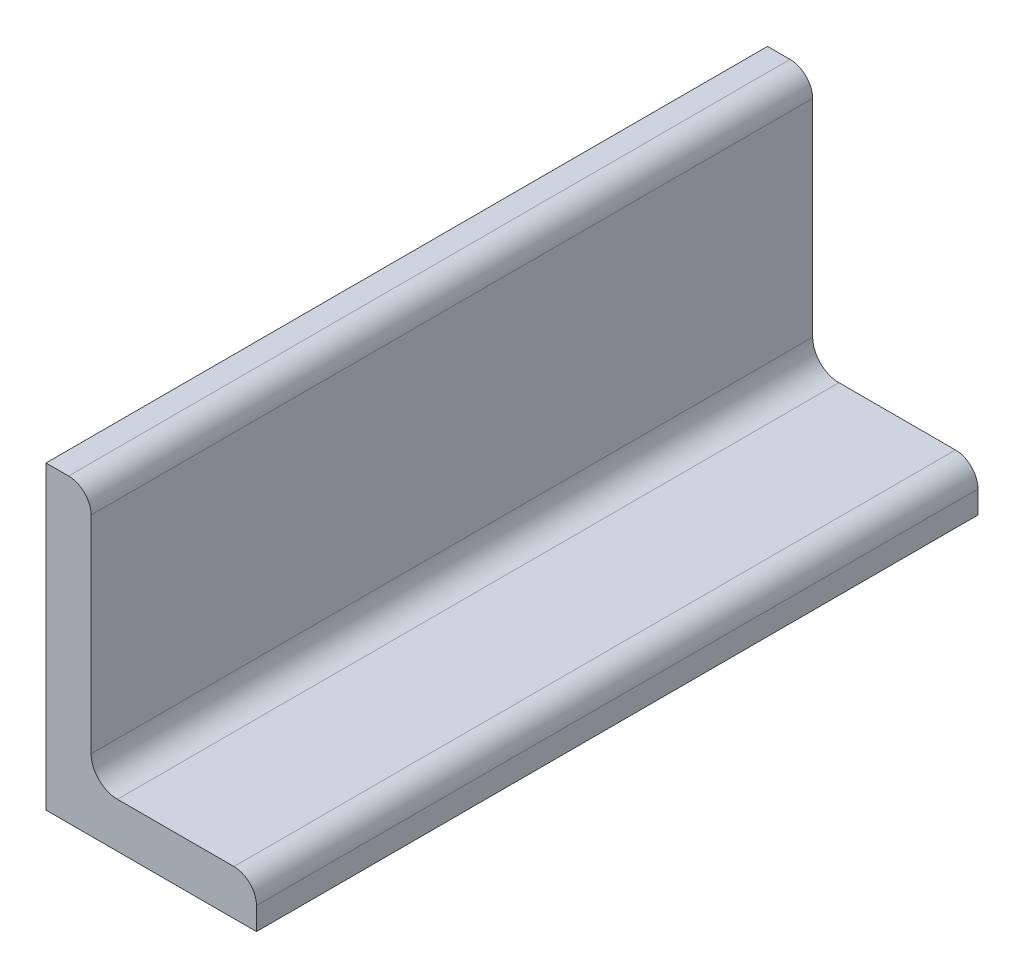
ISO-10303-21;
HEADER;
FILE_DESCRIPTION(('STEP AP214'),'2;1');
FILE_NAME('part.step','',(''),(''),'','','');
FILE_SCHEMA(('AUTOMOTIVE_DESIGN { 1 0 10303 214 1 1 1 1 }'));
ENDSEC;
DATA;
#1=APPLICATION_CONTEXT('core data for automotive mechanical design processes');
#2=APPLICATION_PROTOCOL_DEFINITION('international standard','automotive_design',2000,#1);
#3=PRODUCT_CONTEXT('',#1,'mechanical');
#4=PRODUCT('Part','Part','',(#3));
#5=PRODUCT_RELATED_PRODUCT_CATEGORY('part','',(#4));
#6=PRODUCT_DEFINITION_FORMATION('','',#4);
#7=PRODUCT_DEFINITION_CONTEXT('part definition',#1,'design');
#8=PRODUCT_DEFINITION('design','',#6,#7);
#9=PRODUCT_DEFINITION_SHAPE('','',#8);
#10=(LENGTH_UNIT() NAMED_UNIT(*) SI_UNIT(.MILLI.,.METRE.));
#11=(NAMED_UNIT(*) PLANE_ANGLE_UNIT() SI_UNIT($,.RADIAN.));
#12=(NAMED_UNIT(*) SI_UNIT($,.STERADIAN.) SOLID_ANGLE_UNIT());
#13=UNCERTAINTY_MEASURE_WITH_UNIT(LENGTH_MEASURE(1.E-05),#10,'distance_accuracy_value','');
#14=(GEOMETRIC_REPRESENTATION_CONTEXT(3) GLOBAL_UNCERTAINTY_ASSIGNED_CONTEXT((#13)) GLOBAL_UNIT_ASSIGNED_CONTEXT((#10,
#11,#12)) REPRESENTATION_CONTEXT('',''));
#15=CARTESIAN_POINT('',(0.,0.,0.));
#16=DIRECTION('',(0.,0.,1.));
#17=DIRECTION('',(1.,0.,0.));
#18=AXIS2_PLACEMENT_3D('',#15,#16,#17);
#19=CARTESIAN_POINT('',(0.0836264027816469,127.041655270204,304.8));
#20=DIRECTION('',(1.,0.,0.));
#21=DIRECTION('',(0.,0.,-1.));
#22=AXIS2_PLACEMENT_3D('',#19,#20,#21);
#23=PLANE('',#22);
#24=DIRECTION('',(0.,-1.,0.));
#25=VECTOR('',#24,1.);
#26=CARTESIAN_POINT('',(0.0836264027816469,127.041655270204,0.));
#27=LINE('',#26,#25);
#28=CARTESIAN_POINT('',(0.0836264027816469,127.041655270204,0.));
#29=VERTEX_POINT('',#28);
#30=CARTESIAN_POINT('',(0.0836264027816469,0.0416552702040917,0.));
#31=VERTEX_POINT('',#30);
#32=EDGE_CURVE('E135',#29,#31,#27,.T.);
#33=ORIENTED_EDGE('',*,*,#32,.T.);
#34=DIRECTION('',(0.,0.,-1.));
#35=VECTOR('',#34,1.);
#36=CARTESIAN_POINT('',(0.0836264027816469,0.0416552702040917,304.8));
#37=LINE('',#36,#35);
#38=CARTESIAN_POINT('',(0.0836264027816469,0.0416552702040917,304.8));
#39=VERTEX_POINT('',#38);
#40=EDGE_CURVE('E11',#39,#31,#37,.T.);
#41=ORIENTED_EDGE('',*,*,#40,.F.);
#42=DIRECTION('',(0.,-1.,0.));
#43=VECTOR('',#42,1.);
#44=CARTESIAN_POINT('',(0.0836264027816469,127.041655270204,304.8));
#45=LINE('',#44,#43);
#46=CARTESIAN_POINT('',(0.0836264027816469,127.041655270204,304.8));
#47=VERTEX_POINT('',#46);
#48=EDGE_CURVE('E151',#47,#39,#45,.T.);
#49=ORIENTED_EDGE('',*,*,#48,.F.);
#50=DIRECTION('',(0.,0.,-1.));
#51=VECTOR('',#50,1.);
#52=CARTESIAN_POINT('',(0.0836264027816469,127.041655270204,304.8));
#53=LINE('',#52,#51);
#54=EDGE_CURVE('E131',#47,#29,#53,.T.);
#55=ORIENTED_EDGE('',*,*,#54,.T.);
#56=EDGE_LOOP('',(#33,#41,#49,#55));
#57=FACE_BOUND('',#56,.T.);
#58=ADVANCED_FACE('F33',(#57),#23,.F.);
#59=CARTESIAN_POINT('',(0.0836264027816469,0.0416552702040917,304.8));
#60=DIRECTION('',(0.,1.,0.));
#61=DIRECTION('',(0.,0.,1.));
#62=AXIS2_PLACEMENT_3D('',#59,#60,#61);
#63=PLANE('',#62);
#64=DIRECTION('',(1.,0.,0.));
#65=VECTOR('',#64,1.);
#66=CARTESIAN_POINT('',(0.0836264027816469,0.0416552702040917,0.));
#67=LINE('',#66,#65);
#68=CARTESIAN_POINT('',(88.9836264027817,0.0416552702040917,0.));
#69=VERTEX_POINT('',#68);
#70=EDGE_CURVE('E138',#31,#69,#67,.T.);
#71=ORIENTED_EDGE('',*,*,#70,.T.);
#72=DIRECTION('',(0.,0.,-1.));
#73=VECTOR('',#72,1.);
#74=CARTESIAN_POINT('',(88.9836264027817,0.0416552702040917,304.8));
#75=LINE('',#74,#73);
#76=CARTESIAN_POINT('',(88.9836264027817,0.0416552702040917,304.8));
#77=VERTEX_POINT('',#76);
#78=EDGE_CURVE('E41',#77,#69,#75,.T.);
#79=ORIENTED_EDGE('',*,*,#78,.F.);
#80=DIRECTION('',(1.,0.,0.));
#81=VECTOR('',#80,1.);
#82=CARTESIAN_POINT('',(0.0836264027816469,0.0416552702040917,304.8));
#83=LINE('',#82,#81);
#84=EDGE_CURVE('E95',#39,#77,#83,.T.);
#85=ORIENTED_EDGE('',*,*,#84,.F.);
#86=ORIENTED_EDGE('',*,*,#40,.T.);
#87=EDGE_LOOP('',(#71,#79,#85,#86));
#88=FACE_BOUND('',#87,.T.);
#89=ADVANCED_FACE('F194',(#88),#63,.F.);
#90=CARTESIAN_POINT('',(88.9836264027817,0.0416552702040917,304.8));
#91=DIRECTION('',(-1.,0.,0.));
#92=DIRECTION('',(0.,0.,1.));
#93=AXIS2_PLACEMENT_3D('',#90,#91,#92);
#94=PLANE('',#93);
#95=DIRECTION('',(0.,1.,0.));
#96=VECTOR('',#95,1.);
#97=CARTESIAN_POINT('',(88.9836264027817,0.0416552702040917,0.));
#98=LINE('',#97,#96);
#99=CARTESIAN_POINT('',(88.9836264027817,9.56665527020409,0.));
#100=VERTEX_POINT('',#99);
#101=EDGE_CURVE('E140',#69,#100,#98,.T.);
#102=ORIENTED_EDGE('',*,*,#101,.T.);
#103=DIRECTION('',(0.,0.,-1.));
#104=VECTOR('',#103,1.);
#105=CARTESIAN_POINT('',(88.9836264027817,9.56665527020409,304.8));
#106=LINE('',#105,#104);
#107=CARTESIAN_POINT('',(88.9836264027817,9.56665527020409,304.8));
#108=VERTEX_POINT('',#107);
#109=EDGE_CURVE('E161',#108,#100,#106,.T.);
#110=ORIENTED_EDGE('',*,*,#109,.F.);
#111=DIRECTION('',(0.,1.,0.));
#112=VECTOR('',#111,1.);
#113=CARTESIAN_POINT('',(88.9836264027817,0.0416552702040917,304.8));
#114=LINE('',#113,#112);
#115=EDGE_CURVE('E169',#77,#108,#114,.T.);
#116=ORIENTED_EDGE('',*,*,#115,.F.);
#117=ORIENTED_EDGE('',*,*,#78,.T.);
#118=EDGE_LOOP('',(#102,#110,#116,#117));
#119=FACE_BOUND('',#118,.T.);
#120=ADVANCED_FACE('F167',(#119),#94,.F.);
#121=CARTESIAN_POINT('',(79.4586264027816,9.5666552702041,304.8));
#122=DIRECTION('',(0.,0.,-1.));
#123=DIRECTION('',(-1.,0.,0.));
#124=AXIS2_PLACEMENT_3D('',#121,#122,#123);
#125=CYLINDRICAL_SURFACE('',#124,9.52500000000001);
#126=CARTESIAN_POINT('',(79.4586264027816,9.5666552702041,0.));
#127=DIRECTION('',(0.,0.,1.));
#128=DIRECTION('',(1.,0.,0.));
#129=AXIS2_PLACEMENT_3D('',#126,#127,#128);
#130=CIRCLE('',#129,9.52500000000001);
#131=CARTESIAN_POINT('',(79.4586264027816,19.0916552702041,0.));
#132=VERTEX_POINT('',#131);
#133=EDGE_CURVE('E142',#100,#132,#130,.T.);
#134=ORIENTED_EDGE('',*,*,#133,.T.);
#135=DIRECTION('',(0.,0.,-1.));
#136=VECTOR('',#135,1.);
#137=CARTESIAN_POINT('',(79.4586264027816,19.0916552702041,304.8));
#138=LINE('',#137,#136);
#139=CARTESIAN_POINT('',(79.4586264027816,19.0916552702041,304.8));
#140=VERTEX_POINT('',#139);
#141=EDGE_CURVE('E158',#140,#132,#138,.T.);
#142=ORIENTED_EDGE('',*,*,#141,.F.);
#143=CARTESIAN_POINT('',(79.4586264027816,9.5666552702041,304.8));
#144=DIRECTION('',(0.,0.,1.));
#145=DIRECTION('',(1.,0.,0.));
#146=AXIS2_PLACEMENT_3D('',#143,#144,#145);
#147=CIRCLE('',#146,9.52500000000001);
#148=EDGE_CURVE('E185',#108,#140,#147,.T.);
#149=ORIENTED_EDGE('',*,*,#148,.F.);
#150=ORIENTED_EDGE('',*,*,#109,.T.);
#151=EDGE_LOOP('',(#134,#142,#149,#150));
#152=FACE_BOUND('',#151,.T.);
#153=ADVANCED_FACE('F178',(#152),#125,.T.);
#154=CARTESIAN_POINT('',(79.4586264027816,19.0916552702041,304.8));
#155=DIRECTION('',(0.,-1.,0.));
#156=DIRECTION('',(0.,0.,-1.));
#157=AXIS2_PLACEMENT_3D('',#154,#155,#156);
#158=PLANE('',#157);
#159=DIRECTION('',(-1.,0.,0.));
#160=VECTOR('',#159,1.);
#161=CARTESIAN_POINT('',(79.4586264027816,19.0916552702041,0.));
#162=LINE('',#161,#160);
#163=CARTESIAN_POINT('',(30.2461264027816,19.0916552702041,0.));
#164=VERTEX_POINT('',#163);
#165=EDGE_CURVE('E144',#132,#164,#162,.T.);
#166=ORIENTED_EDGE('',*,*,#165,.T.);
#167=DIRECTION('',(0.,0.,-1.));
#168=VECTOR('',#167,1.);
#169=CARTESIAN_POINT('',(30.2461264027816,19.0916552702041,304.8));
#170=LINE('',#169,#168);
#171=CARTESIAN_POINT('',(30.2461264027816,19.0916552702041,304.8));
#172=VERTEX_POINT('',#171);
#173=EDGE_CURVE('E155',#172,#164,#170,.T.);
#174=ORIENTED_EDGE('',*,*,#173,.F.);
#175=DIRECTION('',(-1.,0.,0.));
#176=VECTOR('',#175,1.);
#177=CARTESIAN_POINT('',(79.4586264027816,19.0916552702041,304.8));
#178=LINE('',#177,#176);
#179=EDGE_CURVE('E184',#140,#172,#178,.T.);
#180=ORIENTED_EDGE('',*,*,#179,.F.);
#181=ORIENTED_EDGE('',*,*,#141,.T.);
#182=EDGE_LOOP('',(#166,#174,#180,#181));
#183=FACE_BOUND('',#182,.T.);
#184=ADVANCED_FACE('F182',(#183),#158,.F.);
#185=CARTESIAN_POINT('',(30.2461264027816,30.2041552702041,304.8));
#186=DIRECTION('',(0.,0.,-1.));
#187=DIRECTION('',(-1.,0.,0.));
#188=AXIS2_PLACEMENT_3D('',#185,#186,#187);
#189=CYLINDRICAL_SURFACE('',#188,11.1125);
#190=CARTESIAN_POINT('',(30.2461264027816,30.2041552702041,0.));
#191=DIRECTION('',(0.,0.,-1.));
#192=DIRECTION('',(1.,0.,0.));
#193=AXIS2_PLACEMENT_3D('',#190,#191,#192);
#194=CIRCLE('',#193,11.1125);
#195=CARTESIAN_POINT('',(19.1336264027816,30.2041552702041,0.));
#196=VERTEX_POINT('',#195);
#197=EDGE_CURVE('E146',#164,#196,#194,.T.);
#198=ORIENTED_EDGE('',*,*,#197,.T.);
#199=DIRECTION('',(0.,0.,-1.));
#200=VECTOR('',#199,1.);
#201=CARTESIAN_POINT('',(19.1336264027816,30.2041552702041,304.8));
#202=LINE('',#201,#200);
#203=CARTESIAN_POINT('',(19.1336264027816,30.2041552702041,304.8));
#204=VERTEX_POINT('',#203);
#205=EDGE_CURVE('E126',#204,#196,#202,.T.);
#206=ORIENTED_EDGE('',*,*,#205,.F.);
#207=CARTESIAN_POINT('',(30.2461264027816,30.2041552702041,304.8));
#208=DIRECTION('',(0.,0.,-1.));
#209=DIRECTION('',(1.,0.,0.));
#210=AXIS2_PLACEMENT_3D('',#207,#208,#209);
#211=CIRCLE('',#210,11.1125);
#212=EDGE_CURVE('E117',#172,#204,#211,.T.);
#213=ORIENTED_EDGE('',*,*,#212,.F.);
#214=ORIENTED_EDGE('',*,*,#173,.T.);
#215=EDGE_LOOP('',(#198,#206,#213,#214));
#216=FACE_BOUND('',#215,.T.);
#217=ADVANCED_FACE('F206',(#216),#189,.F.);
#218=CARTESIAN_POINT('',(19.1336264027816,30.2041552702041,304.8));
#219=DIRECTION('',(-1.,0.,0.));
#220=DIRECTION('',(0.,0.,1.));
#221=AXIS2_PLACEMENT_3D('',#218,#219,#220);
#222=PLANE('',#221);
#223=DIRECTION('',(0.,1.,0.));
#224=VECTOR('',#223,1.);
#225=CARTESIAN_POINT('',(19.1336264027816,30.2041552702041,0.));
#226=LINE('',#225,#224);
#227=CARTESIAN_POINT('',(19.1336264027816,117.516655270204,0.));
#228=VERTEX_POINT('',#227);
#229=EDGE_CURVE('E125',#196,#228,#226,.T.);
#230=ORIENTED_EDGE('',*,*,#229,.T.);
#231=DIRECTION('',(0.,0.,-1.));
#232=VECTOR('',#231,1.);
#233=CARTESIAN_POINT('',(19.1336264027816,117.516655270204,304.8));
#234=LINE('',#233,#232);
#235=CARTESIAN_POINT('',(19.1336264027816,117.516655270204,304.8));
#236=VERTEX_POINT('',#235);
#237=EDGE_CURVE('E122',#236,#228,#234,.T.);
#238=ORIENTED_EDGE('',*,*,#237,.F.);
#239=DIRECTION('',(0.,1.,0.));
#240=VECTOR('',#239,1.);
#241=CARTESIAN_POINT('',(19.1336264027816,30.2041552702041,304.8));
#242=LINE('',#241,#240);
#243=EDGE_CURVE('E111',#204,#236,#242,.T.);
#244=ORIENTED_EDGE('',*,*,#243,.F.);
#245=ORIENTED_EDGE('',*,*,#205,.T.);
#246=EDGE_LOOP('',(#230,#238,#244,#245));
#247=FACE_BOUND('',#246,.T.);
#248=ADVANCED_FACE('F123',(#247),#222,.F.);
#249=CARTESIAN_POINT('',(9.60862640278165,117.516655270204,304.8));
#250=DIRECTION('',(0.,0.,-1.));
#251=DIRECTION('',(-1.,0.,0.));
#252=AXIS2_PLACEMENT_3D('',#249,#250,#251);
#253=CYLINDRICAL_SURFACE('',#252,9.52500000000001);
#254=CARTESIAN_POINT('',(9.60862640278165,117.516655270204,0.));
#255=DIRECTION('',(0.,0.,1.));
#256=DIRECTION('',(1.,0.,0.));
#257=AXIS2_PLACEMENT_3D('',#254,#255,#256);
#258=CIRCLE('',#257,9.52500000000001);
#259=CARTESIAN_POINT('',(9.60862640278165,127.041655270204,0.));
#260=VERTEX_POINT('',#259);
#261=EDGE_CURVE('E81',#228,#260,#258,.T.);
#262=ORIENTED_EDGE('',*,*,#261,.T.);
#263=DIRECTION('',(0.,0.,-1.));
#264=VECTOR('',#263,1.);
#265=CARTESIAN_POINT('',(9.60862640278165,127.041655270204,304.8));
#266=LINE('',#265,#264);
#267=CARTESIAN_POINT('',(9.60862640278165,127.041655270204,304.8));
#268=VERTEX_POINT('',#267);
#269=EDGE_CURVE('E127',#268,#260,#266,.T.);
#270=ORIENTED_EDGE('',*,*,#269,.F.);
#271=CARTESIAN_POINT('',(9.60862640278165,117.516655270204,304.8));
#272=DIRECTION('',(0.,0.,1.));
#273=DIRECTION('',(1.,0.,0.));
#274=AXIS2_PLACEMENT_3D('',#271,#272,#273);
#275=CIRCLE('',#274,9.52500000000001);
#276=EDGE_CURVE('E115',#236,#268,#275,.T.);
#277=ORIENTED_EDGE('',*,*,#276,.F.);
#278=ORIENTED_EDGE('',*,*,#237,.T.);
#279=EDGE_LOOP('',(#262,#270,#277,#278));
#280=FACE_BOUND('',#279,.T.);
#281=ADVANCED_FACE('F129',(#280),#253,.T.);
#282=CARTESIAN_POINT('',(9.60862640278165,127.041655270204,304.8));
#283=DIRECTION('',(0.,-1.,0.));
#284=DIRECTION('',(0.,0.,-1.));
#285=AXIS2_PLACEMENT_3D('',#282,#283,#284);
#286=PLANE('',#285);
#287=DIRECTION('',(-1.,0.,0.));
#288=VECTOR('',#287,1.);
#289=CARTESIAN_POINT('',(9.60862640278165,127.041655270204,0.));
#290=LINE('',#289,#288);
#291=EDGE_CURVE('E87',#260,#29,#290,.T.);
#292=ORIENTED_EDGE('',*,*,#291,.T.);
#293=ORIENTED_EDGE('',*,*,#54,.F.);
#294=DIRECTION('',(-1.,0.,0.));
#295=VECTOR('',#294,1.);
#296=CARTESIAN_POINT('',(9.60862640278165,127.041655270204,304.8));
#297=LINE('',#296,#295);
#298=EDGE_CURVE('E49',#268,#47,#297,.T.);
#299=ORIENTED_EDGE('',*,*,#298,.F.);
#300=ORIENTED_EDGE('',*,*,#269,.T.);
#301=EDGE_LOOP('',(#292,#293,#299,#300));
#302=FACE_BOUND('',#301,.T.);
#303=ADVANCED_FACE('F214',(#302),#286,.F.);
#304=CARTESIAN_POINT('',(79.4586264027816,9.5666552702041,304.8));
#305=DIRECTION('',(0.,0.,1.));
#306=DIRECTION('',(1.,0.,0.));
#307=AXIS2_PLACEMENT_3D('',#304,#305,#306);
#308=PLANE('',#307);
#309=ORIENTED_EDGE('',*,*,#48,.T.);
#310=ORIENTED_EDGE('',*,*,#84,.T.);
#311=ORIENTED_EDGE('',*,*,#115,.T.);
#312=ORIENTED_EDGE('',*,*,#148,.T.);
#313=ORIENTED_EDGE('',*,*,#179,.T.);
#314=ORIENTED_EDGE('',*,*,#212,.T.);
#315=ORIENTED_EDGE('',*,*,#243,.T.);
#316=ORIENTED_EDGE('',*,*,#276,.T.);
#317=ORIENTED_EDGE('',*,*,#298,.T.);
#318=EDGE_LOOP('',(#309,#310,#311,#312,#313,#314,#315,#316,#317));
#319=FACE_BOUND('',#318,.T.);
#320=ADVANCED_FACE('F113',(#319),#308,.T.);
#321=CARTESIAN_POINT('',(79.4586264027816,9.5666552702041,0.));
#322=DIRECTION('',(0.,0.,1.));
#323=DIRECTION('',(1.,0.,0.));
#324=AXIS2_PLACEMENT_3D('',#321,#322,#323);
#325=PLANE('',#324);
#326=ORIENTED_EDGE('',*,*,#32,.F.);
#327=ORIENTED_EDGE('',*,*,#291,.F.);
#328=ORIENTED_EDGE('',*,*,#261,.F.);
#329=ORIENTED_EDGE('',*,*,#229,.F.);
#330=ORIENTED_EDGE('',*,*,#197,.F.);
#331=ORIENTED_EDGE('',*,*,#165,.F.);
#332=ORIENTED_EDGE('',*,*,#133,.F.);
#333=ORIENTED_EDGE('',*,*,#101,.F.);
#334=ORIENTED_EDGE('',*,*,#70,.F.);
#335=EDGE_LOOP('',(#326,#327,#328,#329,#330,#331,#332,#333,#334));
#336=FACE_BOUND('',#335,.T.);
#337=ADVANCED_FACE('F173',(#336),#325,.F.);
#338=CLOSED_SHELL('',(#58,#89,#120,#153,#184,#217,#248,#281,#303,#320,#337));
#339=MANIFOLD_SOLID_BREP('B2',#338);
#340=ADVANCED_BREP_SHAPE_REPRESENTATION('',(#18,#339),#14);
#341=SHAPE_DEFINITION_REPRESENTATION(#9,#340);
ENDSEC;
END-ISO-10303-21;
